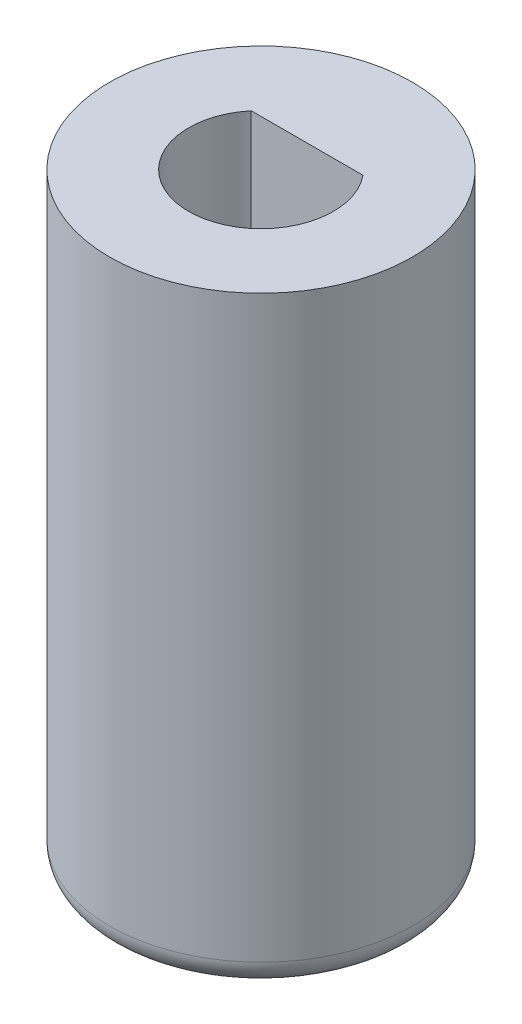
ISO-10303-21;
HEADER;
FILE_DESCRIPTION(('STEP AP214'),'2;1');
FILE_NAME('part.step','',(''),(''),'','','');
FILE_SCHEMA(('AUTOMOTIVE_DESIGN { 1 0 10303 214 1 1 1 1 }'));
ENDSEC;
DATA;
#1=APPLICATION_CONTEXT('core data for automotive mechanical design processes');
#2=APPLICATION_PROTOCOL_DEFINITION('international standard','automotive_design',2000,#1);
#3=PRODUCT_CONTEXT('',#1,'mechanical');
#4=PRODUCT('Part','Part','',(#3));
#5=PRODUCT_RELATED_PRODUCT_CATEGORY('part','',(#4));
#6=PRODUCT_DEFINITION_FORMATION('','',#4);
#7=PRODUCT_DEFINITION_CONTEXT('part definition',#1,'design');
#8=PRODUCT_DEFINITION('design','',#6,#7);
#9=PRODUCT_DEFINITION_SHAPE('','',#8);
#10=(LENGTH_UNIT() NAMED_UNIT(*) SI_UNIT(.MILLI.,.METRE.));
#11=(NAMED_UNIT(*) PLANE_ANGLE_UNIT() SI_UNIT($,.RADIAN.));
#12=(NAMED_UNIT(*) SI_UNIT($,.STERADIAN.) SOLID_ANGLE_UNIT());
#13=UNCERTAINTY_MEASURE_WITH_UNIT(LENGTH_MEASURE(1.E-05),#10,'distance_accuracy_value','');
#14=(GEOMETRIC_REPRESENTATION_CONTEXT(3) GLOBAL_UNCERTAINTY_ASSIGNED_CONTEXT((#13)) GLOBAL_UNIT_ASSIGNED_CONTEXT((#10,
#11,#12)) REPRESENTATION_CONTEXT('',''));
#15=CARTESIAN_POINT('',(0.,0.,0.));
#16=DIRECTION('',(0.,0.,1.));
#17=DIRECTION('',(1.,0.,0.));
#18=AXIS2_PLACEMENT_3D('',#15,#16,#17);
#19=CARTESIAN_POINT('',(0.,20.,0.));
#20=DIRECTION('',(0.,1.,0.));
#21=DIRECTION('',(0.,0.,1.));
#22=AXIS2_PLACEMENT_3D('',#19,#20,#21);
#23=PLANE('',#22);
#24=CARTESIAN_POINT('',(0.,20.,0.));
#25=DIRECTION('',(0.,1.,0.));
#26=DIRECTION('',(0.,0.,1.));
#27=AXIS2_PLACEMENT_3D('',#24,#25,#26);
#28=CIRCLE('',#27,5.75);
#29=CARTESIAN_POINT('',(0.,20.,5.75));
#30=VERTEX_POINT('',#29);
#31=EDGE_CURVE('E76',#30,#30,#28,.T.);
#32=ORIENTED_EDGE('',*,*,#31,.T.);
#33=EDGE_LOOP('',(#32));
#34=FACE_BOUND('',#33,.T.);
#35=CARTESIAN_POINT('',(0.,20.,0.));
#36=DIRECTION('',(0.,1.,0.));
#37=DIRECTION('',(0.,0.,1.));
#38=AXIS2_PLACEMENT_3D('',#35,#36,#37);
#39=CIRCLE('',#38,2.75);
#40=CARTESIAN_POINT('',(-2.12132034355964,20.,-1.75));
#41=VERTEX_POINT('',#40);
#42=CARTESIAN_POINT('',(2.12132034355964,20.,-1.75));
#43=VERTEX_POINT('',#42);
#44=EDGE_CURVE('E67',#41,#43,#39,.T.);
#45=ORIENTED_EDGE('',*,*,#44,.F.);
#46=DIRECTION('',(1.,0.,0.));
#47=VECTOR('',#46,1.);
#48=CARTESIAN_POINT('',(-2.12132034355964,20.,-1.75));
#49=LINE('',#48,#47);
#50=EDGE_CURVE('E70',#41,#43,#49,.T.);
#51=ORIENTED_EDGE('',*,*,#50,.T.);
#52=EDGE_LOOP('',(#45,#51));
#53=FACE_BOUND('',#52,.T.);
#54=ADVANCED_FACE('F33',(#34,#53),#23,.T.);
#55=CARTESIAN_POINT('',(0.,20.,0.));
#56=DIRECTION('',(0.,-1.,0.));
#57=DIRECTION('',(0.,0.,-1.));
#58=AXIS2_PLACEMENT_3D('',#55,#56,#57);
#59=CYLINDRICAL_SURFACE('',#58,5.75);
#60=CARTESIAN_POINT('',(0.,-2.,0.));
#61=DIRECTION('',(0.,-1.,0.));
#62=DIRECTION('',(0.,0.,-1.));
#63=AXIS2_PLACEMENT_3D('',#60,#61,#62);
#64=CIRCLE('',#63,5.75);
#65=CARTESIAN_POINT('',(0.,-2.,-5.75));
#66=VERTEX_POINT('',#65);
#67=EDGE_CURVE('E11',#66,#66,#64,.F.);
#68=ORIENTED_EDGE('',*,*,#67,.T.);
#69=EDGE_LOOP('',(#68));
#70=FACE_BOUND('',#69,.T.);
#71=CARTESIAN_POINT('',(0.,11.1,-5.75));
#72=CARTESIAN_POINT('',(-0.0611893734617842,11.0999976868231,-5.74999888450915));
#73=CARTESIAN_POINT('',(-0.122408585116231,11.0948771028759,-5.74901320114105));
#74=CARTESIAN_POINT('',(-0.243120308834112,11.0745441646119,-5.74517614141151));
#75=CARTESIAN_POINT('',(-0.30261134634795,11.0593234419824,-5.74232321800425));
#76=CARTESIAN_POINT('',(-0.418103650480747,11.0192746187026,-5.73507064531795));
#77=CARTESIAN_POINT('',(-0.474108071040099,10.9944553517781,-5.73067241855108));
#78=CARTESIAN_POINT('',(-0.581153088107705,10.9359393969353,-5.72080887801052));
#79=CARTESIAN_POINT('',(-0.632194054220048,10.9022433707198,-5.71534364378294));
#80=CARTESIAN_POINT('',(-0.728503194337437,10.8264854841537,-5.70387276384098));
#81=CARTESIAN_POINT('',(-0.773700683790853,10.7843345643602,-5.69786177366299));
#82=CARTESIAN_POINT('',(-0.856428221670006,10.6930549413673,-5.68601628938854));
#83=CARTESIAN_POINT('',(-0.893957705334174,10.6439257246559,-5.68018180831921));
#84=CARTESIAN_POINT('',(-0.960579951542255,10.5395819128528,-5.66929792533947));
#85=CARTESIAN_POINT('',(-0.98960042665394,10.4843203814642,-5.66425541010675));
#86=CARTESIAN_POINT('',(-1.03791801396416,10.3695935328833,-5.65560187600705));
#87=CARTESIAN_POINT('',(-1.05721600077795,10.3101285943698,-5.6519907283834));
#88=CARTESIAN_POINT('',(-1.08531317796392,10.1894405016928,-5.6466626736043));
#89=CARTESIAN_POINT('',(-1.09423586360682,10.1282471007332,-5.64492350358311));
#90=CARTESIAN_POINT('',(-1.10171255793426,10.0052089971503,-5.64346923153462));
#91=CARTESIAN_POINT('',(-1.10026753509106,9.94336435589979,-5.64375394045196));
#92=CARTESIAN_POINT('',(-1.08714988316767,9.82167663746995,-5.64629500098579));
#93=CARTESIAN_POINT('',(-1.07561802142617,9.76181773526656,-5.64852421480057));
#94=CARTESIAN_POINT('',(-1.04287587773206,9.64490020763532,-5.65466045172879));
#95=CARTESIAN_POINT('',(-1.02166516926548,9.58784170573434,-5.6585675487804));
#96=CARTESIAN_POINT('',(-0.970030732657679,9.47773463189094,-5.66764750377169));
#97=CARTESIAN_POINT('',(-0.939550476466872,9.42471323225089,-5.67282808952496));
#98=CARTESIAN_POINT('',(-0.870282117257168,9.32448463197088,-5.68386623514503));
#99=CARTESIAN_POINT('',(-0.831493137729088,9.2772780455791,-5.68972386640511));
#100=CARTESIAN_POINT('',(-0.745951021926396,9.18920608956597,-5.70157414027389));
#101=CARTESIAN_POINT('',(-0.699077559458006,9.14845758559255,-5.70756742034501));
#102=CARTESIAN_POINT('',(-0.599098849094959,9.07538419727769,-5.71892539299673));
#103=CARTESIAN_POINT('',(-0.545993533770687,9.0430594040943,-5.72429007877461));
#104=CARTESIAN_POINT('',(-0.434934322955016,8.98773249486083,-5.733797917708));
#105=CARTESIAN_POINT('',(-0.376974044283385,8.96474289213275,-5.73793942925104));
#106=CARTESIAN_POINT('',(-0.257917382707241,8.92885902674516,-5.74452166919851));
#107=CARTESIAN_POINT('',(-0.196821347634601,8.91596364695788,-5.7469625858045));
#108=CARTESIAN_POINT('',(-0.0742325540449399,8.900797775487,-5.7498426524625));
#109=CARTESIAN_POINT('',(-0.0127602836747129,8.89836721742263,-5.75031195690548));
#110=CARTESIAN_POINT('',(0.109712202662312,8.90377011047071,-5.74927935432993));
#111=CARTESIAN_POINT('',(0.170712442652261,8.91160303573926,-5.74777754830015));
#112=CARTESIAN_POINT('',(0.289999001731871,8.93717749533204,-5.74299027453036));
#113=CARTESIAN_POINT('',(0.348303397220675,8.95483769739754,-5.73971945362237));
#114=CARTESIAN_POINT('',(0.461123673043722,8.99947713180492,-5.73175943181348));
#115=CARTESIAN_POINT('',(0.515639287704557,9.02645701686269,-5.72707013157045));
#116=CARTESIAN_POINT('',(0.620015228967094,9.08932184659021,-5.71671810671894));
#117=CARTESIAN_POINT('',(0.669815850345041,9.12530416968724,-5.71104496066414));
#118=CARTESIAN_POINT('',(0.762729555302829,9.20502111322203,-5.69938069584439));
#119=CARTESIAN_POINT('',(0.805841986230561,9.24875648933298,-5.69338954612424));
#120=CARTESIAN_POINT('',(0.884766585097851,9.34346392492221,-5.68166399530804));
#121=CARTESIAN_POINT('',(0.920469319839859,9.39452786177597,-5.67593430213596));
#122=CARTESIAN_POINT('',(0.982790645103218,9.50202231794029,-5.6654766113728));
#123=CARTESIAN_POINT('',(1.00940958149538,9.5584526328183,-5.66074857564564));
#124=CARTESIAN_POINT('',(1.05265424959346,9.67480565221812,-5.65286679413052));
#125=CARTESIAN_POINT('',(1.06932930010954,9.73470947641813,-5.64970529222716));
#126=CARTESIAN_POINT('',(1.09236423220727,9.8565350067085,-5.64529719042863));
#127=CARTESIAN_POINT('',(1.09872533102643,9.91845647379957,-5.64405036456711));
#128=CARTESIAN_POINT('',(1.10090976599817,10.0414626567192,-5.6436245714212));
#129=CARTESIAN_POINT('',(1.09690580908787,10.1025442545469,-5.64441171291433));
#130=CARTESIAN_POINT('',(1.07885281478219,10.2231464125866,-5.64788984254847));
#131=CARTESIAN_POINT('',(1.06480384333514,10.2826669830445,-5.65058081819027));
#132=CARTESIAN_POINT('',(1.02713374589531,10.3983595476461,-5.65754887407516));
#133=CARTESIAN_POINT('',(1.0035320613502,10.4545380786579,-5.6618227313844));
#134=CARTESIAN_POINT('',(0.947445661191506,10.5621653816783,-5.6714771380325));
#135=CARTESIAN_POINT('',(0.914960282657754,10.6136138003329,-5.6768577699538));
#136=CARTESIAN_POINT('',(0.84143134712317,10.711184045607,-5.68822422067829));
#137=CARTESIAN_POINT('',(0.800262383891917,10.7572104366632,-5.69421815961979));
#138=CARTESIAN_POINT('',(0.710795661268637,10.8417591015898,-5.70607585335452));
#139=CARTESIAN_POINT('',(0.662496266652922,10.8802796494299,-5.71193957792984));
#140=CARTESIAN_POINT('',(0.559593442178571,10.9490637007564,-5.72294113549254));
#141=CARTESIAN_POINT('',(0.504934853679229,10.9792459038725,-5.72807160086631));
#142=CARTESIAN_POINT('',(0.391241020531427,11.029950157494,-5.7369564770497));
#143=CARTESIAN_POINT('',(0.332209896753916,11.0504811729276,-5.74071216416166));
#144=CARTESIAN_POINT('',(0.227514307004095,11.0771886702711,-5.74566933064967));
#145=CARTESIAN_POINT('',(0.182457272740348,11.0857281127918,-5.74728406173339));
#146=CARTESIAN_POINT('',(0.0916057205409538,11.0971345662884,-5.74944979948876));
#147=CARTESIAN_POINT('',(0.0458112227346977,11.1000017318279,-5.75000083514501));
#148=CARTESIAN_POINT('',(0.,11.1,-5.75));
#149=B_SPLINE_CURVE_WITH_KNOTS('',3,(#71,#72,#73,#74,#75,#76,#77,#78,#79,#80,#81,#82,#83,#84,
#85,#86,#87,#88,#89,#90,#91,#92,#93,#94,#95,#96,#97,#98,#99,#100,#101,#102,#103,#104,#105,#106,
#107,#108,#109,#110,#111,#112,#113,#114,#115,#116,#117,#118,#119,#120,#121,#122,#123,#124,#125,
#126,#127,#128,#129,#130,#131,#132,#133,#134,#135,#136,#137,#138,#139,#140,#141,#142,#143,#144,
#145,#146,#147,#148),.UNSPECIFIED.,.T.,.F.,(4,2,2,2,2,2,2,2,2,2,2,2,2,2,2,2,2,2,2,2,2,2,2,2,2,2,
2,2,2,2,2,2,2,2,2,2,2,2,4),(0.,0.183400569084725,0.366953281898673,0.550337468061375,
0.733707988030149,0.919122356407043,1.1045503759464,1.29151084105602,1.47845448457861,
1.66314942761287,1.84782711807888,2.02996792657171,2.21211676216792,2.39539945249323,
2.57870148732457,2.76501369459648,2.95132791798131,3.13789106764255,3.32443356743752,
3.50811240661367,3.69178183547379,3.873953318795,4.0561375633161,4.24038480166669,
4.42465000807792,4.61146847241481,4.798279822738,4.9841567656141,5.17001176996784,
5.35278998701756,5.53556700408816,5.71797389342546,5.9003943980694,6.08565593102667,
6.27096001624868,6.45801174601645,6.6448893795693,6.78220134722704,6.91950957322575),.UNSPECIFIED.);
#150=CARTESIAN_POINT('',(0.,11.1,-5.75));
#151=VERTEX_POINT('',#150);
#152=EDGE_CURVE('E82',#151,#151,#149,.T.);
#153=ORIENTED_EDGE('',*,*,#152,.T.);
#154=EDGE_LOOP('',(#153));
#155=FACE_BOUND('',#154,.T.);
#156=ORIENTED_EDGE('',*,*,#31,.F.);
#157=EDGE_LOOP('',(#156));
#158=FACE_BOUND('',#157,.T.);
#159=ADVANCED_FACE('F96',(#70,#155,#158),#59,.T.);
#160=CARTESIAN_POINT('',(0.,20.,0.));
#161=DIRECTION('',(0.,-1.,0.));
#162=DIRECTION('',(0.,0.,-1.));
#163=AXIS2_PLACEMENT_3D('',#160,#161,#162);
#164=CYLINDRICAL_SURFACE('',#163,2.75);
#165=DIRECTION('',(0.,1.,0.));
#166=VECTOR('',#165,1.);
#167=CARTESIAN_POINT('',(-2.12132034355964,-4.35889894354067,-1.75));
#168=LINE('',#167,#166);
#169=CARTESIAN_POINT('',(-2.12132034355964,0.,-1.75));
#170=VERTEX_POINT('',#169);
#171=EDGE_CURVE('E64',#170,#41,#168,.T.);
#172=ORIENTED_EDGE('',*,*,#171,.T.);
#173=ORIENTED_EDGE('',*,*,#44,.T.);
#174=DIRECTION('',(0.,1.,0.));
#175=VECTOR('',#174,1.);
#176=CARTESIAN_POINT('',(2.12132034355964,-4.35889894354067,-1.75));
#177=LINE('',#176,#175);
#178=CARTESIAN_POINT('',(2.12132034355964,0.,-1.75));
#179=VERTEX_POINT('',#178);
#180=EDGE_CURVE('E52',#179,#43,#177,.T.);
#181=ORIENTED_EDGE('',*,*,#180,.F.);
#182=CARTESIAN_POINT('',(0.,0.,0.));
#183=DIRECTION('',(0.,1.,0.));
#184=DIRECTION('',(0.,0.,1.));
#185=AXIS2_PLACEMENT_3D('',#182,#183,#184);
#186=CIRCLE('',#185,2.75);
#187=EDGE_CURVE('E61',#170,#179,#186,.T.);
#188=ORIENTED_EDGE('',*,*,#187,.F.);
#189=EDGE_LOOP('',(#172,#173,#181,#188));
#190=FACE_BOUND('',#189,.T.);
#191=ADVANCED_FACE('F62',(#190),#164,.F.);
#192=CARTESIAN_POINT('',(-2.12132034355964,-4.35889894354067,-1.75));
#193=DIRECTION('',(0.,0.,1.));
#194=DIRECTION('',(1.,0.,0.));
#195=AXIS2_PLACEMENT_3D('',#192,#193,#194);
#196=PLANE('',#195);
#197=CARTESIAN_POINT('',(0.,10.,-1.75));
#198=DIRECTION('',(0.,0.,1.));
#199=DIRECTION('',(1.,0.,0.));
#200=AXIS2_PLACEMENT_3D('',#197,#198,#199);
#201=CIRCLE('',#200,1.1);
#202=CARTESIAN_POINT('',(1.1,10.,-1.75));
#203=VERTEX_POINT('',#202);
#204=EDGE_CURVE('E80',#203,#203,#201,.T.);
#205=ORIENTED_EDGE('',*,*,#204,.F.);
#206=EDGE_LOOP('',(#205));
#207=FACE_BOUND('',#206,.T.);
#208=DIRECTION('',(-1.,0.,0.));
#209=VECTOR('',#208,1.);
#210=CARTESIAN_POINT('',(-2.12132034355964,0.,-1.75));
#211=LINE('',#210,#209);
#212=EDGE_CURVE('E48',#179,#170,#211,.T.);
#213=ORIENTED_EDGE('',*,*,#212,.F.);
#214=ORIENTED_EDGE('',*,*,#180,.T.);
#215=ORIENTED_EDGE('',*,*,#50,.F.);
#216=ORIENTED_EDGE('',*,*,#171,.F.);
#217=EDGE_LOOP('',(#213,#214,#215,#216));
#218=FACE_BOUND('',#217,.T.);
#219=ADVANCED_FACE('F69',(#207,#218),#196,.T.);
#220=CARTESIAN_POINT('',(0.,10.,-5.75));
#221=DIRECTION('',(0.,0.,1.));
#222=DIRECTION('',(1.,0.,0.));
#223=AXIS2_PLACEMENT_3D('',#220,#221,#222);
#224=CYLINDRICAL_SURFACE('',#223,1.1);
#225=ORIENTED_EDGE('',*,*,#204,.T.);
#226=EDGE_LOOP('',(#225));
#227=FACE_BOUND('',#226,.T.);
#228=ORIENTED_EDGE('',*,*,#152,.F.);
#229=EDGE_LOOP('',(#228));
#230=FACE_BOUND('',#229,.T.);
#231=ADVANCED_FACE('F114',(#227,#230),#224,.F.);
#232=CARTESIAN_POINT('',(0.,0.,0.));
#233=DIRECTION('',(0.,-1.,0.));
#234=DIRECTION('',(0.,0.,-1.));
#235=AXIS2_PLACEMENT_3D('',#232,#233,#234);
#236=PLANE('',#235);
#237=ORIENTED_EDGE('',*,*,#212,.T.);
#238=ORIENTED_EDGE('',*,*,#187,.T.);
#239=EDGE_LOOP('',(#237,#238));
#240=FACE_BOUND('',#239,.T.);
#241=ADVANCED_FACE('F72',(#240),#236,.F.);
#242=CARTESIAN_POINT('',(0.,-3.,0.));
#243=DIRECTION('',(0.,-1.,0.));
#244=DIRECTION('',(0.,0.,-1.));
#245=AXIS2_PLACEMENT_3D('',#242,#243,#244);
#246=PLANE('',#245);
#247=CARTESIAN_POINT('',(0.,-3.,0.));
#248=DIRECTION('',(0.,-1.,0.));
#249=DIRECTION('',(0.,0.,-1.));
#250=AXIS2_PLACEMENT_3D('',#247,#248,#249);
#251=CIRCLE('',#250,4.75);
#252=CARTESIAN_POINT('',(0.,-3.,-4.75));
#253=VERTEX_POINT('',#252);
#254=EDGE_CURVE('E41',#253,#253,#251,.T.);
#255=ORIENTED_EDGE('',*,*,#254,.T.);
#256=EDGE_LOOP('',(#255));
#257=FACE_BOUND('',#256,.T.);
#258=ADVANCED_FACE('F86',(#257),#246,.T.);
#259=CARTESIAN_POINT('',(0.,-2.,0.));
#260=DIRECTION('',(0.,-1.,0.));
#261=DIRECTION('',(0.,0.,-1.));
#262=AXIS2_PLACEMENT_3D('',#259,#260,#261);
#263=TOROIDAL_SURFACE('',#262,4.75,1.);
#264=ORIENTED_EDGE('',*,*,#67,.F.);
#265=EDGE_LOOP('',(#264));
#266=FACE_BOUND('',#265,.T.);
#267=ORIENTED_EDGE('',*,*,#254,.F.);
#268=EDGE_LOOP('',(#267));
#269=FACE_BOUND('',#268,.T.);
#270=ADVANCED_FACE('F35',(#266,#269),#263,.T.);
#271=CLOSED_SHELL('',(#54,#159,#191,#219,#231,#241,#258,#270));
#272=MANIFOLD_SOLID_BREP('B2',#271);
#273=ADVANCED_BREP_SHAPE_REPRESENTATION('',(#18,#272),#14);
#274=SHAPE_DEFINITION_REPRESENTATION(#9,#273);
ENDSEC;
END-ISO-10303-21;
